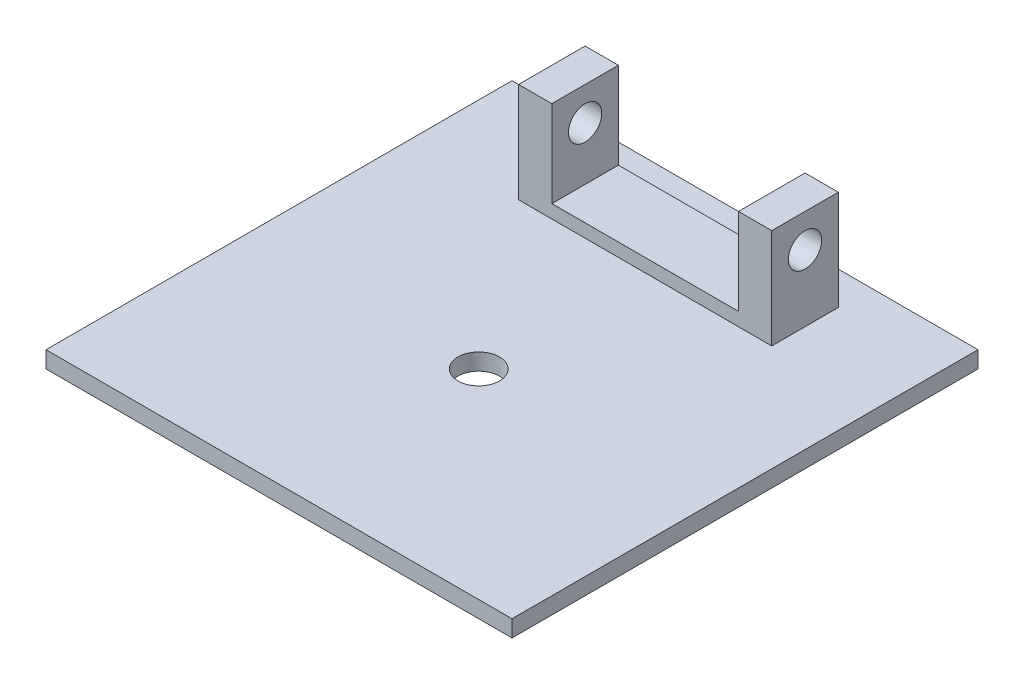
ISO-10303-21;
HEADER;
FILE_DESCRIPTION(('STEP AP214'),'2;1');
FILE_NAME('part.step','',(''),(''),'','','');
FILE_SCHEMA(('AUTOMOTIVE_DESIGN { 1 0 10303 214 1 1 1 1 }'));
ENDSEC;
DATA;
#1=APPLICATION_CONTEXT('core data for automotive mechanical design processes');
#2=APPLICATION_PROTOCOL_DEFINITION('international standard','automotive_design',2000,#1);
#3=PRODUCT_CONTEXT('',#1,'mechanical');
#4=PRODUCT('Part','Part','',(#3));
#5=PRODUCT_RELATED_PRODUCT_CATEGORY('part','',(#4));
#6=PRODUCT_DEFINITION_FORMATION('','',#4);
#7=PRODUCT_DEFINITION_CONTEXT('part definition',#1,'design');
#8=PRODUCT_DEFINITION('design','',#6,#7);
#9=PRODUCT_DEFINITION_SHAPE('','',#8);
#10=(LENGTH_UNIT() NAMED_UNIT(*) SI_UNIT(.MILLI.,.METRE.));
#11=(NAMED_UNIT(*) PLANE_ANGLE_UNIT() SI_UNIT($,.RADIAN.));
#12=(NAMED_UNIT(*) SI_UNIT($,.STERADIAN.) SOLID_ANGLE_UNIT());
#13=UNCERTAINTY_MEASURE_WITH_UNIT(LENGTH_MEASURE(1.E-05),#10,'distance_accuracy_value','');
#14=(GEOMETRIC_REPRESENTATION_CONTEXT(3) GLOBAL_UNCERTAINTY_ASSIGNED_CONTEXT((#13)) GLOBAL_UNIT_ASSIGNED_CONTEXT((#10,
#11,#12)) REPRESENTATION_CONTEXT('',''));
#15=CARTESIAN_POINT('',(0.,0.,0.));
#16=DIRECTION('',(0.,0.,1.));
#17=DIRECTION('',(1.,0.,0.));
#18=AXIS2_PLACEMENT_3D('',#15,#16,#17);
#19=CARTESIAN_POINT('',(0.,44.45,0.));
#20=DIRECTION('',(0.,-1.,0.));
#21=DIRECTION('',(0.,0.,-1.));
#22=AXIS2_PLACEMENT_3D('',#19,#20,#21);
#23=PLANE('',#22);
#24=DIRECTION('',(-1.,0.,0.));
#25=VECTOR('',#24,1.);
#26=CARTESIAN_POINT('',(-48.3034768621521,44.45,-76.2));
#27=LINE('',#26,#25);
#28=CARTESIAN_POINT('',(48.3034768621521,44.45,-76.2));
#29=VERTEX_POINT('',#28);
#30=CARTESIAN_POINT('',(35.603476862152,44.45,-76.2));
#31=VERTEX_POINT('',#30);
#32=EDGE_CURVE('E171',#29,#31,#27,.T.);
#33=ORIENTED_EDGE('',*,*,#32,.T.);
#34=DIRECTION('',(0.,0.,-1.));
#35=VECTOR('',#34,1.);
#36=CARTESIAN_POINT('',(35.603476862152,44.45,88.901));
#37=LINE('',#36,#35);
#38=CARTESIAN_POINT('',(35.603476862152,44.45,-50.7999999999999));
#39=VERTEX_POINT('',#38);
#40=EDGE_CURVE('E146',#39,#31,#37,.T.);
#41=ORIENTED_EDGE('',*,*,#40,.F.);
#42=DIRECTION('',(1.,0.,0.));
#43=VECTOR('',#42,1.);
#44=CARTESIAN_POINT('',(-48.3034768621521,44.45,-50.8));
#45=LINE('',#44,#43);
#46=CARTESIAN_POINT('',(48.3034768621521,44.45,-50.8));
#47=VERTEX_POINT('',#46);
#48=EDGE_CURVE('E151',#39,#47,#45,.T.);
#49=ORIENTED_EDGE('',*,*,#48,.T.);
#50=DIRECTION('',(0.,0.,-1.));
#51=VECTOR('',#50,1.);
#52=CARTESIAN_POINT('',(48.3034768621521,44.45,-50.8));
#53=LINE('',#52,#51);
#54=EDGE_CURVE('E166',#47,#29,#53,.T.);
#55=ORIENTED_EDGE('',*,*,#54,.T.);
#56=EDGE_LOOP('',(#33,#41,#49,#55));
#57=FACE_BOUND('',#56,.T.);
#58=ADVANCED_FACE('F37',(#57),#23,.F.);
#59=CARTESIAN_POINT('',(0.,6.35,0.));
#60=DIRECTION('',(0.,-1.,0.));
#61=DIRECTION('',(0.,0.,-1.));
#62=AXIS2_PLACEMENT_3D('',#59,#60,#61);
#63=PLANE('',#62);
#64=DIRECTION('',(0.,0.,-1.));
#65=VECTOR('',#64,1.);
#66=CARTESIAN_POINT('',(88.9,6.35,88.9));
#67=LINE('',#66,#65);
#68=CARTESIAN_POINT('',(88.9,6.35,88.9));
#69=VERTEX_POINT('',#68);
#70=CARTESIAN_POINT('',(88.9,6.35,-88.9));
#71=VERTEX_POINT('',#70);
#72=EDGE_CURVE('E205',#69,#71,#67,.T.);
#73=ORIENTED_EDGE('',*,*,#72,.T.);
#74=DIRECTION('',(-1.,0.,0.));
#75=VECTOR('',#74,1.);
#76=CARTESIAN_POINT('',(-88.9,6.35,-88.9));
#77=LINE('',#76,#75);
#78=CARTESIAN_POINT('',(-88.9,6.35,-88.9));
#79=VERTEX_POINT('',#78);
#80=EDGE_CURVE('E208',#71,#79,#77,.T.);
#81=ORIENTED_EDGE('',*,*,#80,.T.);
#82=DIRECTION('',(0.,0.,1.));
#83=VECTOR('',#82,1.);
#84=CARTESIAN_POINT('',(-88.9,6.35,88.9));
#85=LINE('',#84,#83);
#86=CARTESIAN_POINT('',(-88.9,6.35,88.9));
#87=VERTEX_POINT('',#86);
#88=EDGE_CURVE('E211',#79,#87,#85,.T.);
#89=ORIENTED_EDGE('',*,*,#88,.T.);
#90=DIRECTION('',(1.,0.,0.));
#91=VECTOR('',#90,1.);
#92=CARTESIAN_POINT('',(-88.9,6.35,88.9));
#93=LINE('',#92,#91);
#94=EDGE_CURVE('E213',#87,#69,#93,.T.);
#95=ORIENTED_EDGE('',*,*,#94,.T.);
#96=EDGE_LOOP('',(#73,#81,#89,#95));
#97=FACE_BOUND('',#96,.T.);
#98=CARTESIAN_POINT('',(0.,6.35,12.7));
#99=DIRECTION('',(0.,1.,0.));
#100=DIRECTION('',(0.,0.,1.));
#101=AXIS2_PLACEMENT_3D('',#98,#99,#100);
#102=CIRCLE('',#101,7.9375);
#103=CARTESIAN_POINT('',(0.,6.35,20.6375));
#104=VERTEX_POINT('',#103);
#105=EDGE_CURVE('E198',#104,#104,#102,.T.);
#106=ORIENTED_EDGE('',*,*,#105,.F.);
#107=EDGE_LOOP('',(#106));
#108=FACE_BOUND('',#107,.T.);
#109=DIRECTION('',(0.,0.,-1.));
#110=VECTOR('',#109,1.);
#111=CARTESIAN_POINT('',(48.3034768621521,6.35,-50.8));
#112=LINE('',#111,#110);
#113=CARTESIAN_POINT('',(48.3034768621521,6.35,-50.8));
#114=VERTEX_POINT('',#113);
#115=CARTESIAN_POINT('',(48.3034768621521,6.35,-76.2));
#116=VERTEX_POINT('',#115);
#117=EDGE_CURVE('E145',#114,#116,#112,.T.);
#118=ORIENTED_EDGE('',*,*,#117,.F.);
#119=DIRECTION('',(1.,0.,0.));
#120=VECTOR('',#119,1.);
#121=CARTESIAN_POINT('',(-48.3034768621521,6.35,-50.8));
#122=LINE('',#121,#120);
#123=CARTESIAN_POINT('',(-48.3034768621521,6.35,-50.8));
#124=VERTEX_POINT('',#123);
#125=EDGE_CURVE('E170',#124,#114,#122,.T.);
#126=ORIENTED_EDGE('',*,*,#125,.F.);
#127=DIRECTION('',(0.,0.,1.));
#128=VECTOR('',#127,1.);
#129=CARTESIAN_POINT('',(-48.3034768621521,6.35,-50.8));
#130=LINE('',#129,#128);
#131=CARTESIAN_POINT('',(-48.3034768621521,6.35,-76.2));
#132=VERTEX_POINT('',#131);
#133=EDGE_CURVE('E183',#132,#124,#130,.T.);
#134=ORIENTED_EDGE('',*,*,#133,.F.);
#135=DIRECTION('',(-1.,0.,0.));
#136=VECTOR('',#135,1.);
#137=CARTESIAN_POINT('',(-48.3034768621521,6.35,-76.2));
#138=LINE('',#137,#136);
#139=EDGE_CURVE('E61',#116,#132,#138,.T.);
#140=ORIENTED_EDGE('',*,*,#139,.F.);
#141=EDGE_LOOP('',(#118,#126,#134,#140));
#142=FACE_BOUND('',#141,.T.);
#143=ADVANCED_FACE('F248',(#97,#108,#142),#63,.F.);
#144=CARTESIAN_POINT('',(88.9,6.35,88.9));
#145=DIRECTION('',(-1.,0.,0.));
#146=DIRECTION('',(0.,0.,1.));
#147=AXIS2_PLACEMENT_3D('',#144,#145,#146);
#148=PLANE('',#147);
#149=DIRECTION('',(0.,0.,-1.));
#150=VECTOR('',#149,1.);
#151=CARTESIAN_POINT('',(88.9,0.,88.9));
#152=LINE('',#151,#150);
#153=CARTESIAN_POINT('',(88.9,0.,88.9));
#154=VERTEX_POINT('',#153);
#155=CARTESIAN_POINT('',(88.9,0.,-88.9));
#156=VERTEX_POINT('',#155);
#157=EDGE_CURVE('E202',#154,#156,#152,.T.);
#158=ORIENTED_EDGE('',*,*,#157,.T.);
#159=DIRECTION('',(0.,-1.,0.));
#160=VECTOR('',#159,1.);
#161=CARTESIAN_POINT('',(88.9,6.35,-88.9));
#162=LINE('',#161,#160);
#163=EDGE_CURVE('E11',#71,#156,#162,.T.);
#164=ORIENTED_EDGE('',*,*,#163,.F.);
#165=ORIENTED_EDGE('',*,*,#72,.F.);
#166=DIRECTION('',(0.,-1.,0.));
#167=VECTOR('',#166,1.);
#168=CARTESIAN_POINT('',(88.9,6.35,88.9));
#169=LINE('',#168,#167);
#170=EDGE_CURVE('E215',#69,#154,#169,.T.);
#171=ORIENTED_EDGE('',*,*,#170,.T.);
#172=EDGE_LOOP('',(#158,#164,#165,#171));
#173=FACE_BOUND('',#172,.T.);
#174=ADVANCED_FACE('F39',(#173),#148,.F.);
#175=CARTESIAN_POINT('',(-88.9,6.35,-88.9));
#176=DIRECTION('',(0.,0.,1.));
#177=DIRECTION('',(1.,0.,0.));
#178=AXIS2_PLACEMENT_3D('',#175,#176,#177);
#179=PLANE('',#178);
#180=DIRECTION('',(-1.,0.,0.));
#181=VECTOR('',#180,1.);
#182=CARTESIAN_POINT('',(-88.9,0.,-88.9));
#183=LINE('',#182,#181);
#184=CARTESIAN_POINT('',(-88.9,0.,-88.9));
#185=VERTEX_POINT('',#184);
#186=EDGE_CURVE('E218',#156,#185,#183,.T.);
#187=ORIENTED_EDGE('',*,*,#186,.T.);
#188=DIRECTION('',(0.,-1.,0.));
#189=VECTOR('',#188,1.);
#190=CARTESIAN_POINT('',(-88.9,6.35,-88.9));
#191=LINE('',#190,#189);
#192=EDGE_CURVE('E46',#79,#185,#191,.T.);
#193=ORIENTED_EDGE('',*,*,#192,.F.);
#194=ORIENTED_EDGE('',*,*,#80,.F.);
#195=ORIENTED_EDGE('',*,*,#163,.T.);
#196=EDGE_LOOP('',(#187,#193,#194,#195));
#197=FACE_BOUND('',#196,.T.);
#198=ADVANCED_FACE('F250',(#197),#179,.F.);
#199=CARTESIAN_POINT('',(-88.9,6.35,88.9));
#200=DIRECTION('',(1.,0.,0.));
#201=DIRECTION('',(0.,0.,-1.));
#202=AXIS2_PLACEMENT_3D('',#199,#200,#201);
#203=PLANE('',#202);
#204=DIRECTION('',(0.,0.,1.));
#205=VECTOR('',#204,1.);
#206=CARTESIAN_POINT('',(-88.9,0.,88.9));
#207=LINE('',#206,#205);
#208=CARTESIAN_POINT('',(-88.9,0.,88.9));
#209=VERTEX_POINT('',#208);
#210=EDGE_CURVE('E220',#185,#209,#207,.T.);
#211=ORIENTED_EDGE('',*,*,#210,.T.);
#212=DIRECTION('',(0.,-1.,0.));
#213=VECTOR('',#212,1.);
#214=CARTESIAN_POINT('',(-88.9,6.35,88.9));
#215=LINE('',#214,#213);
#216=EDGE_CURVE('E225',#87,#209,#215,.T.);
#217=ORIENTED_EDGE('',*,*,#216,.F.);
#218=ORIENTED_EDGE('',*,*,#88,.F.);
#219=ORIENTED_EDGE('',*,*,#192,.T.);
#220=EDGE_LOOP('',(#211,#217,#218,#219));
#221=FACE_BOUND('',#220,.T.);
#222=ADVANCED_FACE('F233',(#221),#203,.F.);
#223=CARTESIAN_POINT('',(-88.9,6.35,88.9));
#224=DIRECTION('',(0.,0.,-1.));
#225=DIRECTION('',(-1.,0.,0.));
#226=AXIS2_PLACEMENT_3D('',#223,#224,#225);
#227=PLANE('',#226);
#228=DIRECTION('',(1.,0.,0.));
#229=VECTOR('',#228,1.);
#230=CARTESIAN_POINT('',(-88.9,0.,88.9));
#231=LINE('',#230,#229);
#232=EDGE_CURVE('E209',#209,#154,#231,.T.);
#233=ORIENTED_EDGE('',*,*,#232,.T.);
#234=ORIENTED_EDGE('',*,*,#170,.F.);
#235=ORIENTED_EDGE('',*,*,#94,.F.);
#236=ORIENTED_EDGE('',*,*,#216,.T.);
#237=EDGE_LOOP('',(#233,#234,#235,#236));
#238=FACE_BOUND('',#237,.T.);
#239=ADVANCED_FACE('F242',(#238),#227,.F.);
#240=CARTESIAN_POINT('',(0.,0.,0.));
#241=DIRECTION('',(0.,-1.,0.));
#242=DIRECTION('',(0.,0.,-1.));
#243=AXIS2_PLACEMENT_3D('',#240,#241,#242);
#244=PLANE('',#243);
#245=CARTESIAN_POINT('',(0.,0.,12.7));
#246=DIRECTION('',(0.,1.,0.));
#247=DIRECTION('',(0.,0.,1.));
#248=AXIS2_PLACEMENT_3D('',#245,#246,#247);
#249=CIRCLE('',#248,7.9375);
#250=CARTESIAN_POINT('',(0.,0.,20.6375));
#251=VERTEX_POINT('',#250);
#252=EDGE_CURVE('E199',#251,#251,#249,.T.);
#253=ORIENTED_EDGE('',*,*,#252,.T.);
#254=EDGE_LOOP('',(#253));
#255=FACE_BOUND('',#254,.T.);
#256=ORIENTED_EDGE('',*,*,#157,.F.);
#257=ORIENTED_EDGE('',*,*,#232,.F.);
#258=ORIENTED_EDGE('',*,*,#210,.F.);
#259=ORIENTED_EDGE('',*,*,#186,.F.);
#260=EDGE_LOOP('',(#256,#257,#258,#259));
#261=FACE_BOUND('',#260,.T.);
#262=ADVANCED_FACE('F239',(#255,#261),#244,.T.);
#263=CARTESIAN_POINT('',(0.,0.,12.7));
#264=DIRECTION('',(0.,1.,0.));
#265=DIRECTION('',(0.,0.,1.));
#266=AXIS2_PLACEMENT_3D('',#263,#264,#265);
#267=CYLINDRICAL_SURFACE('',#266,7.9375);
#268=ORIENTED_EDGE('',*,*,#252,.F.);
#269=EDGE_LOOP('',(#268));
#270=FACE_BOUND('',#269,.T.);
#271=ORIENTED_EDGE('',*,*,#105,.T.);
#272=EDGE_LOOP('',(#271));
#273=FACE_BOUND('',#272,.T.);
#274=ADVANCED_FACE('F290',(#270,#273),#267,.F.);
#275=CARTESIAN_POINT('',(48.3034768621521,44.45,-50.8));
#276=DIRECTION('',(-1.,0.,0.));
#277=DIRECTION('',(0.,0.,1.));
#278=AXIS2_PLACEMENT_3D('',#275,#276,#277);
#279=PLANE('',#278);
#280=CARTESIAN_POINT('',(48.3034768621521,31.75,-63.5));
#281=DIRECTION('',(-1.,0.,0.));
#282=DIRECTION('',(0.,0.,1.));
#283=AXIS2_PLACEMENT_3D('',#280,#281,#282);
#284=CIRCLE('',#283,6.35);
#285=CARTESIAN_POINT('',(48.3034768621521,31.75,-57.15));
#286=VERTEX_POINT('',#285);
#287=EDGE_CURVE('E156',#286,#286,#284,.T.);
#288=ORIENTED_EDGE('',*,*,#287,.T.);
#289=EDGE_LOOP('',(#288));
#290=FACE_BOUND('',#289,.T.);
#291=ORIENTED_EDGE('',*,*,#117,.T.);
#292=DIRECTION('',(0.,-1.,0.));
#293=VECTOR('',#292,1.);
#294=CARTESIAN_POINT('',(48.3034768621521,44.45,-76.2));
#295=LINE('',#294,#293);
#296=EDGE_CURVE('E196',#29,#116,#295,.T.);
#297=ORIENTED_EDGE('',*,*,#296,.F.);
#298=ORIENTED_EDGE('',*,*,#54,.F.);
#299=DIRECTION('',(0.,-1.,0.));
#300=VECTOR('',#299,1.);
#301=CARTESIAN_POINT('',(48.3034768621521,44.45,-50.8));
#302=LINE('',#301,#300);
#303=EDGE_CURVE('E179',#47,#114,#302,.T.);
#304=ORIENTED_EDGE('',*,*,#303,.T.);
#305=EDGE_LOOP('',(#291,#297,#298,#304));
#306=FACE_BOUND('',#305,.T.);
#307=ADVANCED_FACE('F288',(#290,#306),#279,.F.);
#308=CARTESIAN_POINT('',(-48.3034768621521,44.45,-76.2));
#309=DIRECTION('',(0.,0.,1.));
#310=DIRECTION('',(1.,0.,0.));
#311=AXIS2_PLACEMENT_3D('',#308,#309,#310);
#312=PLANE('',#311);
#313=DIRECTION('',(-1.,0.,0.));
#314=VECTOR('',#313,1.);
#315=CARTESIAN_POINT('',(35.603476862152,11.43,-76.2));
#316=LINE('',#315,#314);
#317=CARTESIAN_POINT('',(35.603476862152,11.43,-76.2));
#318=VERTEX_POINT('',#317);
#319=CARTESIAN_POINT('',(-35.6034768621521,11.43,-76.2));
#320=VERTEX_POINT('',#319);
#321=EDGE_CURVE('E154',#318,#320,#316,.T.);
#322=ORIENTED_EDGE('',*,*,#321,.F.);
#323=DIRECTION('',(0.,-1.,0.));
#324=VECTOR('',#323,1.);
#325=CARTESIAN_POINT('',(35.603476862152,44.45,-76.2));
#326=LINE('',#325,#324);
#327=EDGE_CURVE('E133',#31,#318,#326,.T.);
#328=ORIENTED_EDGE('',*,*,#327,.F.);
#329=ORIENTED_EDGE('',*,*,#32,.F.);
#330=ORIENTED_EDGE('',*,*,#296,.T.);
#331=ORIENTED_EDGE('',*,*,#139,.T.);
#332=DIRECTION('',(0.,-1.,0.));
#333=VECTOR('',#332,1.);
#334=CARTESIAN_POINT('',(-48.3034768621521,44.45,-76.2));
#335=LINE('',#334,#333);
#336=CARTESIAN_POINT('',(-48.3034768621521,44.45,-76.2));
#337=VERTEX_POINT('',#336);
#338=EDGE_CURVE('E193',#337,#132,#335,.T.);
#339=ORIENTED_EDGE('',*,*,#338,.F.);
#340=CARTESIAN_POINT('',(-35.6034768621521,44.45,-76.2));
#341=VERTEX_POINT('',#340);
#342=EDGE_CURVE('E169',#341,#337,#27,.T.);
#343=ORIENTED_EDGE('',*,*,#342,.F.);
#344=DIRECTION('',(0.,1.,0.));
#345=VECTOR('',#344,1.);
#346=CARTESIAN_POINT('',(-35.6034768621521,44.45,-76.2));
#347=LINE('',#346,#345);
#348=EDGE_CURVE('E53',#320,#341,#347,.T.);
#349=ORIENTED_EDGE('',*,*,#348,.F.);
#350=EDGE_LOOP('',(#322,#328,#329,#330,#331,#339,#343,#349));
#351=FACE_BOUND('',#350,.T.);
#352=ADVANCED_FACE('F283',(#351),#312,.F.);
#353=CARTESIAN_POINT('',(-48.3034768621521,44.45,-50.8));
#354=DIRECTION('',(1.,0.,0.));
#355=DIRECTION('',(0.,0.,-1.));
#356=AXIS2_PLACEMENT_3D('',#353,#354,#355);
#357=PLANE('',#356);
#358=CARTESIAN_POINT('',(-48.3034768621521,31.75,-63.5));
#359=DIRECTION('',(-1.,0.,0.));
#360=DIRECTION('',(0.,0.,1.));
#361=AXIS2_PLACEMENT_3D('',#358,#359,#360);
#362=CIRCLE('',#361,6.35);
#363=CARTESIAN_POINT('',(-48.3034768621521,31.75,-57.15));
#364=VERTEX_POINT('',#363);
#365=EDGE_CURVE('E432',#364,#364,#362,.T.);
#366=ORIENTED_EDGE('',*,*,#365,.F.);
#367=EDGE_LOOP('',(#366));
#368=FACE_BOUND('',#367,.T.);
#369=ORIENTED_EDGE('',*,*,#133,.T.);
#370=DIRECTION('',(0.,-1.,0.));
#371=VECTOR('',#370,1.);
#372=CARTESIAN_POINT('',(-48.3034768621521,44.45,-50.8));
#373=LINE('',#372,#371);
#374=CARTESIAN_POINT('',(-48.3034768621521,44.45,-50.8));
#375=VERTEX_POINT('',#374);
#376=EDGE_CURVE('E190',#375,#124,#373,.T.);
#377=ORIENTED_EDGE('',*,*,#376,.F.);
#378=DIRECTION('',(0.,0.,1.));
#379=VECTOR('',#378,1.);
#380=CARTESIAN_POINT('',(-48.3034768621521,44.45,-50.8));
#381=LINE('',#380,#379);
#382=EDGE_CURVE('E174',#337,#375,#381,.T.);
#383=ORIENTED_EDGE('',*,*,#382,.F.);
#384=ORIENTED_EDGE('',*,*,#338,.T.);
#385=EDGE_LOOP('',(#369,#377,#383,#384));
#386=FACE_BOUND('',#385,.T.);
#387=ADVANCED_FACE('F277',(#368,#386),#357,.F.);
#388=CARTESIAN_POINT('',(-48.3034768621521,44.45,-50.8));
#389=DIRECTION('',(0.,0.,-1.));
#390=DIRECTION('',(-1.,0.,0.));
#391=AXIS2_PLACEMENT_3D('',#388,#389,#390);
#392=PLANE('',#391);
#393=ORIENTED_EDGE('',*,*,#48,.F.);
#394=DIRECTION('',(0.,1.,0.));
#395=VECTOR('',#394,1.);
#396=CARTESIAN_POINT('',(35.603476862152,44.45,-50.8));
#397=LINE('',#396,#395);
#398=CARTESIAN_POINT('',(35.603476862152,11.43,-50.8));
#399=VERTEX_POINT('',#398);
#400=EDGE_CURVE('E130',#399,#39,#397,.T.);
#401=ORIENTED_EDGE('',*,*,#400,.F.);
#402=DIRECTION('',(1.,0.,0.));
#403=VECTOR('',#402,1.);
#404=CARTESIAN_POINT('',(35.603476862152,11.43,-50.8));
#405=LINE('',#404,#403);
#406=CARTESIAN_POINT('',(-35.6034768621521,11.43,-50.7999999999999));
#407=VERTEX_POINT('',#406);
#408=EDGE_CURVE('E140',#407,#399,#405,.T.);
#409=ORIENTED_EDGE('',*,*,#408,.F.);
#410=DIRECTION('',(0.,-1.,0.));
#411=VECTOR('',#410,1.);
#412=CARTESIAN_POINT('',(-35.6034768621521,44.45,-50.8));
#413=LINE('',#412,#411);
#414=CARTESIAN_POINT('',(-35.6034768621521,44.45,-50.7999999999999));
#415=VERTEX_POINT('',#414);
#416=EDGE_CURVE('E152',#415,#407,#413,.T.);
#417=ORIENTED_EDGE('',*,*,#416,.F.);
#418=EDGE_CURVE('E176',#375,#415,#45,.T.);
#419=ORIENTED_EDGE('',*,*,#418,.F.);
#420=ORIENTED_EDGE('',*,*,#376,.T.);
#421=ORIENTED_EDGE('',*,*,#125,.T.);
#422=ORIENTED_EDGE('',*,*,#303,.F.);
#423=EDGE_LOOP('',(#393,#401,#409,#417,#419,#420,#421,#422));
#424=FACE_BOUND('',#423,.T.);
#425=ADVANCED_FACE('F149',(#424),#392,.F.);
#426=ORIENTED_EDGE('',*,*,#418,.T.);
#427=DIRECTION('',(0.,0.,-1.));
#428=VECTOR('',#427,1.);
#429=CARTESIAN_POINT('',(-35.6034768621521,44.45,88.901));
#430=LINE('',#429,#428);
#431=EDGE_CURVE('E163',#415,#341,#430,.T.);
#432=ORIENTED_EDGE('',*,*,#431,.T.);
#433=ORIENTED_EDGE('',*,*,#342,.T.);
#434=ORIENTED_EDGE('',*,*,#382,.T.);
#435=EDGE_LOOP('',(#426,#432,#433,#434));
#436=FACE_BOUND('',#435,.T.);
#437=ADVANCED_FACE('F260',(#436),#23,.F.);
#438=CARTESIAN_POINT('',(35.603476862152,44.45,88.901));
#439=DIRECTION('',(1.,0.,0.));
#440=DIRECTION('',(0.,0.,-1.));
#441=AXIS2_PLACEMENT_3D('',#438,#439,#440);
#442=PLANE('',#441);
#443=CARTESIAN_POINT('',(35.603476862152,31.75,-63.5));
#444=DIRECTION('',(1.,0.,0.));
#445=DIRECTION('',(0.,0.,-1.));
#446=AXIS2_PLACEMENT_3D('',#443,#444,#445);
#447=CIRCLE('',#446,6.35);
#448=CARTESIAN_POINT('',(35.603476862152,31.75,-57.15));
#449=VERTEX_POINT('',#448);
#450=EDGE_CURVE('E428',#449,#449,#447,.T.);
#451=ORIENTED_EDGE('',*,*,#450,.T.);
#452=EDGE_LOOP('',(#451));
#453=FACE_BOUND('',#452,.T.);
#454=ORIENTED_EDGE('',*,*,#400,.T.);
#455=ORIENTED_EDGE('',*,*,#40,.T.);
#456=ORIENTED_EDGE('',*,*,#327,.T.);
#457=DIRECTION('',(0.,0.,-1.));
#458=VECTOR('',#457,1.);
#459=CARTESIAN_POINT('',(35.603476862152,11.43,88.901));
#460=LINE('',#459,#458);
#461=EDGE_CURVE('E126',#399,#318,#460,.T.);
#462=ORIENTED_EDGE('',*,*,#461,.F.);
#463=EDGE_LOOP('',(#454,#455,#456,#462));
#464=FACE_BOUND('',#463,.T.);
#465=ADVANCED_FACE('F128',(#453,#464),#442,.F.);
#466=CARTESIAN_POINT('',(-35.6034768621521,44.45,88.901));
#467=DIRECTION('',(-1.,0.,0.));
#468=DIRECTION('',(0.,-1.,0.));
#469=AXIS2_PLACEMENT_3D('',#466,#467,#468);
#470=PLANE('',#469);
#471=CARTESIAN_POINT('',(-35.6034768621521,31.75,-63.5));
#472=DIRECTION('',(-1.,0.,0.));
#473=DIRECTION('',(0.,-1.,0.));
#474=AXIS2_PLACEMENT_3D('',#471,#472,#473);
#475=CIRCLE('',#474,6.35);
#476=CARTESIAN_POINT('',(-35.6034768621521,25.4,-63.5));
#477=VERTEX_POINT('',#476);
#478=EDGE_CURVE('E41',#477,#477,#475,.T.);
#479=ORIENTED_EDGE('',*,*,#478,.T.);
#480=EDGE_LOOP('',(#479));
#481=FACE_BOUND('',#480,.T.);
#482=ORIENTED_EDGE('',*,*,#416,.T.);
#483=DIRECTION('',(0.,0.,-1.));
#484=VECTOR('',#483,1.);
#485=CARTESIAN_POINT('',(-35.6034768621521,11.43,88.901));
#486=LINE('',#485,#484);
#487=EDGE_CURVE('E137',#407,#320,#486,.T.);
#488=ORIENTED_EDGE('',*,*,#487,.T.);
#489=ORIENTED_EDGE('',*,*,#348,.T.);
#490=ORIENTED_EDGE('',*,*,#431,.F.);
#491=EDGE_LOOP('',(#482,#488,#489,#490));
#492=FACE_BOUND('',#491,.T.);
#493=ADVANCED_FACE('F275',(#481,#492),#470,.F.);
#494=CARTESIAN_POINT('',(35.603476862152,11.43,88.901));
#495=DIRECTION('',(0.,-1.,0.));
#496=DIRECTION('',(0.,0.,-1.));
#497=AXIS2_PLACEMENT_3D('',#494,#495,#496);
#498=PLANE('',#497);
#499=ORIENTED_EDGE('',*,*,#408,.T.);
#500=ORIENTED_EDGE('',*,*,#461,.T.);
#501=ORIENTED_EDGE('',*,*,#321,.T.);
#502=ORIENTED_EDGE('',*,*,#487,.F.);
#503=EDGE_LOOP('',(#499,#500,#501,#502));
#504=FACE_BOUND('',#503,.T.);
#505=ADVANCED_FACE('F141',(#504),#498,.F.);
#506=CARTESIAN_POINT('',(88.9,31.75,-63.5));
#507=DIRECTION('',(-1.,0.,0.));
#508=DIRECTION('',(0.,0.,1.));
#509=AXIS2_PLACEMENT_3D('',#506,#507,#508);
#510=CYLINDRICAL_SURFACE('',#509,6.35);
#511=ORIENTED_EDGE('',*,*,#365,.T.);
#512=EDGE_LOOP('',(#511));
#513=FACE_BOUND('',#512,.T.);
#514=ORIENTED_EDGE('',*,*,#478,.F.);
#515=EDGE_LOOP('',(#514));
#516=FACE_BOUND('',#515,.T.);
#517=ADVANCED_FACE('F398',(#513,#516),#510,.F.);
#518=CARTESIAN_POINT('',(35.603476862152,31.75,-57.15));
#519=CARTESIAN_POINT('',(35.7357685288187,31.75,-57.15));
#520=CARTESIAN_POINT('',(35.8680601954854,31.75,-57.15));
#521=CARTESIAN_POINT('',(36.1326435288187,31.75,-57.15));
#522=CARTESIAN_POINT('',(36.2649351954854,31.75,-57.15));
#523=CARTESIAN_POINT('',(36.5295185288187,31.75,-57.15));
#524=CARTESIAN_POINT('',(36.6618101954854,31.75,-57.15));
#525=CARTESIAN_POINT('',(36.9263935288187,31.75,-57.15));
#526=CARTESIAN_POINT('',(37.0586851954854,31.75,-57.15));
#527=CARTESIAN_POINT('',(37.3232685288187,31.75,-57.15));
#528=CARTESIAN_POINT('',(37.4555601954854,31.75,-57.15));
#529=CARTESIAN_POINT('',(37.7201435288187,31.75,-57.15));
#530=CARTESIAN_POINT('',(37.8524351954854,31.75,-57.15));
#531=CARTESIAN_POINT('',(38.1170185288187,31.75,-57.15));
#532=CARTESIAN_POINT('',(38.2493101954854,31.75,-57.15));
#533=CARTESIAN_POINT('',(38.5138935288187,31.75,-57.15));
#534=CARTESIAN_POINT('',(38.6461851954854,31.75,-57.15));
#535=CARTESIAN_POINT('',(38.9107685288187,31.75,-57.15));
#536=CARTESIAN_POINT('',(39.0430601954854,31.75,-57.15));
#537=CARTESIAN_POINT('',(39.3076435288187,31.75,-57.15));
#538=CARTESIAN_POINT('',(39.4399351954854,31.75,-57.15));
#539=CARTESIAN_POINT('',(39.7045185288187,31.75,-57.15));
#540=CARTESIAN_POINT('',(39.8368101954854,31.75,-57.15));
#541=CARTESIAN_POINT('',(40.1013935288187,31.75,-57.15));
#542=CARTESIAN_POINT('',(40.2336851954854,31.75,-57.15));
#543=CARTESIAN_POINT('',(40.4982685288187,31.75,-57.15));
#544=CARTESIAN_POINT('',(40.6305601954854,31.75,-57.15));
#545=CARTESIAN_POINT('',(40.8951435288187,31.75,-57.15));
#546=CARTESIAN_POINT('',(41.0274351954854,31.75,-57.15));
#547=CARTESIAN_POINT('',(41.2920185288187,31.75,-57.15));
#548=CARTESIAN_POINT('',(41.4243101954854,31.75,-57.15));
#549=CARTESIAN_POINT('',(41.6888935288187,31.75,-57.15));
#550=CARTESIAN_POINT('',(41.8211851954854,31.75,-57.15));
#551=CARTESIAN_POINT('',(42.0857685288187,31.75,-57.15));
#552=CARTESIAN_POINT('',(42.2180601954854,31.75,-57.15));
#553=CARTESIAN_POINT('',(42.4826435288187,31.75,-57.15));
#554=CARTESIAN_POINT('',(42.6149351954854,31.75,-57.15));
#555=CARTESIAN_POINT('',(42.8795185288187,31.75,-57.15));
#556=CARTESIAN_POINT('',(43.0118101954854,31.75,-57.15));
#557=CARTESIAN_POINT('',(43.2763935288187,31.75,-57.15));
#558=CARTESIAN_POINT('',(43.4086851954854,31.75,-57.15));
#559=CARTESIAN_POINT('',(43.6732685288187,31.75,-57.15));
#560=CARTESIAN_POINT('',(43.8055601954854,31.75,-57.15));
#561=CARTESIAN_POINT('',(44.0701435288187,31.75,-57.15));
#562=CARTESIAN_POINT('',(44.2024351954854,31.75,-57.15));
#563=CARTESIAN_POINT('',(44.4670185288187,31.75,-57.15));
#564=CARTESIAN_POINT('',(44.5993101954854,31.75,-57.15));
#565=CARTESIAN_POINT('',(44.8638935288187,31.75,-57.15));
#566=CARTESIAN_POINT('',(44.9961851954854,31.75,-57.15));
#567=CARTESIAN_POINT('',(45.2607685288187,31.75,-57.15));
#568=CARTESIAN_POINT('',(45.3930601954854,31.75,-57.15));
#569=CARTESIAN_POINT('',(45.6576435288187,31.75,-57.15));
#570=CARTESIAN_POINT('',(45.7899351954854,31.75,-57.15));
#571=CARTESIAN_POINT('',(46.0545185288187,31.75,-57.15));
#572=CARTESIAN_POINT('',(46.1868101954854,31.75,-57.15));
#573=CARTESIAN_POINT('',(46.4513935288187,31.75,-57.15));
#574=CARTESIAN_POINT('',(46.5836851954854,31.75,-57.15));
#575=CARTESIAN_POINT('',(46.8482685288187,31.75,-57.15));
#576=CARTESIAN_POINT('',(46.9805601954854,31.75,-57.15));
#577=CARTESIAN_POINT('',(47.2451435288187,31.75,-57.15));
#578=CARTESIAN_POINT('',(47.3774351954854,31.75,-57.15));
#579=CARTESIAN_POINT('',(47.6420185288187,31.75,-57.15));
#580=CARTESIAN_POINT('',(47.7743101954854,31.75,-57.15));
#581=CARTESIAN_POINT('',(48.0388935288187,31.75,-57.15));
#582=CARTESIAN_POINT('',(48.1711851954854,31.75,-57.15));
#583=CARTESIAN_POINT('',(48.3034768621521,31.75,-57.15));
#584=B_SPLINE_CURVE_WITH_KNOTS('',3,(#518,#519,#520,#521,#522,#523,#524,#525,#526,#527,#528,
#529,#530,#531,#532,#533,#534,#535,#536,#537,#538,#539,#540,#541,#542,#543,#544,#545,#546,#547,
#548,#549,#550,#551,#552,#553,#554,#555,#556,#557,#558,#559,#560,#561,#562,#563,#564,#565,#566,
#567,#568,#569,#570,#571,#572,#573,#574,#575,#576,#577,#578,#579,#580,#581,#582,#583),
.UNSPECIFIED.,.F.,.F.,(4,2,2,2,2,2,2,2,2,2,2,2,2,2,2,2,2,2,2,2,2,2,2,2,2,2,2,2,2,2,2,2,4),(0.,
0.396874999999998,0.793750000000003,1.190625,1.5875,1.984375,2.38125,2.778125,3.175,3.571875,
3.96875,4.365625,4.7625,5.159375,5.55625,5.953125,6.35,6.746875,7.14375,7.540625,7.9375,
8.334375,8.73125,9.128125,9.52500000000001,9.921875,10.31875,10.715625,11.1125,11.509375,
11.90625,12.303125,12.7),.UNSPECIFIED.);
#585=EDGE_CURVE('BSEAM407',#449,#286,#584,.T.);
#586=ORIENTED_EDGE('',*,*,#450,.F.);
#587=ORIENTED_EDGE('',*,*,#287,.F.);
#588=ORIENTED_EDGE('',*,*,#585,.T.);
#589=ORIENTED_EDGE('',*,*,#585,.F.);
#590=EDGE_LOOP('',(#586,#588,#587,#589));
#591=FACE_BOUND('',#590,.T.);
#592=ADVANCED_FACE('F407',(#591),#510,.F.);
#593=CLOSED_SHELL('',(#58,#143,#174,#198,#222,#239,#262,#274,#307,#352,#387,#425,#437,#465,#493,
#505,#517,#592));
#594=MANIFOLD_SOLID_BREP('B2',#593);
#595=ADVANCED_BREP_SHAPE_REPRESENTATION('',(#18,#594),#14);
#596=SHAPE_DEFINITION_REPRESENTATION(#9,#595);
ENDSEC;
END-ISO-10303-21;
